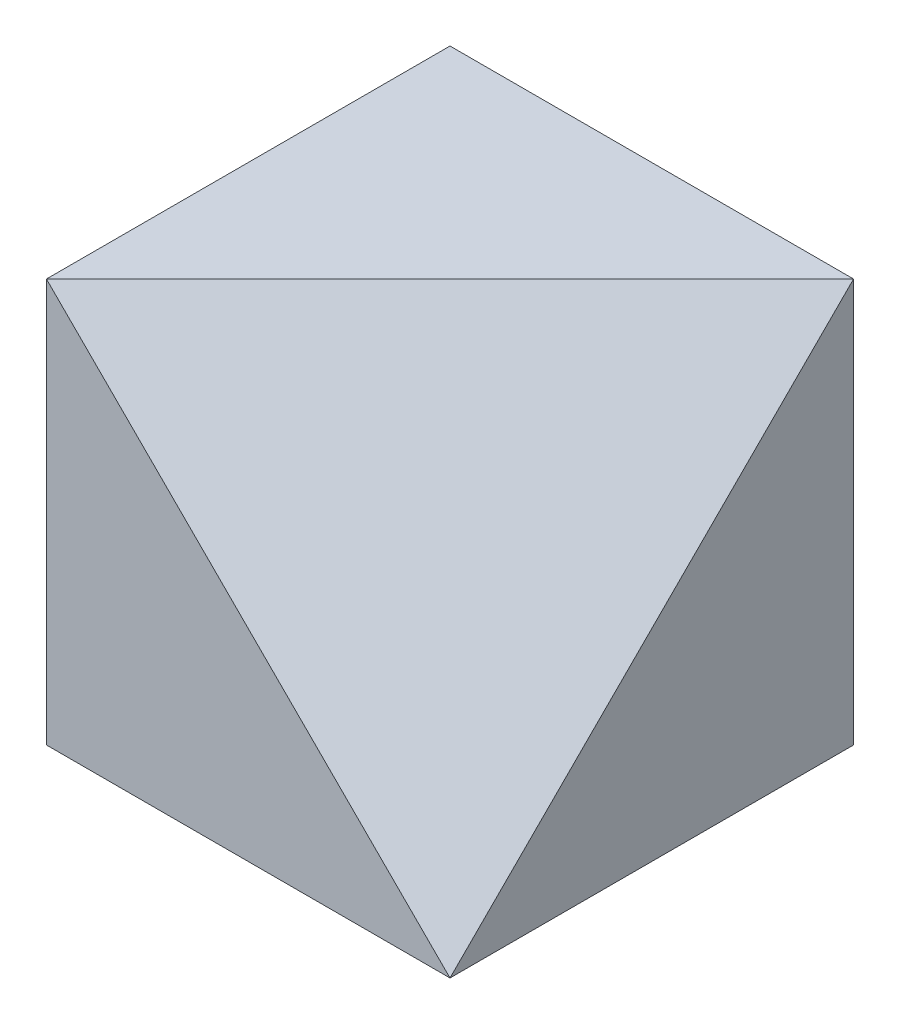
ISO-10303-21;
HEADER;
FILE_DESCRIPTION(('STEP AP214'),'2;1');
FILE_NAME('part.step','',(''),(''),'','','');
FILE_SCHEMA(('AUTOMOTIVE_DESIGN { 1 0 10303 214 1 1 1 1 }'));
ENDSEC;
DATA;
#1=APPLICATION_CONTEXT('core data for automotive mechanical design processes');
#2=APPLICATION_PROTOCOL_DEFINITION('international standard','automotive_design',2000,#1);
#3=PRODUCT_CONTEXT('',#1,'mechanical');
#4=PRODUCT('Part','Part','',(#3));
#5=PRODUCT_RELATED_PRODUCT_CATEGORY('part','',(#4));
#6=PRODUCT_DEFINITION_FORMATION('','',#4);
#7=PRODUCT_DEFINITION_CONTEXT('part definition',#1,'design');
#8=PRODUCT_DEFINITION('design','',#6,#7);
#9=PRODUCT_DEFINITION_SHAPE('','',#8);
#10=(LENGTH_UNIT() NAMED_UNIT(*) SI_UNIT(.MILLI.,.METRE.));
#11=(NAMED_UNIT(*) PLANE_ANGLE_UNIT() SI_UNIT($,.RADIAN.));
#12=(NAMED_UNIT(*) SI_UNIT($,.STERADIAN.) SOLID_ANGLE_UNIT());
#13=UNCERTAINTY_MEASURE_WITH_UNIT(LENGTH_MEASURE(1.E-05),#10,'distance_accuracy_value','');
#14=(GEOMETRIC_REPRESENTATION_CONTEXT(3) GLOBAL_UNCERTAINTY_ASSIGNED_CONTEXT((#13)) GLOBAL_UNIT_ASSIGNED_CONTEXT((#10,
#11,#12)) REPRESENTATION_CONTEXT('',''));
#15=CARTESIAN_POINT('',(0.,0.,0.));
#16=DIRECTION('',(0.,0.,1.));
#17=DIRECTION('',(1.,0.,0.));
#18=AXIS2_PLACEMENT_3D('',#15,#16,#17);
#19=CARTESIAN_POINT('',(63.5,-63.5,63.5));
#20=DIRECTION('',(-1.,0.,0.));
#21=DIRECTION('',(0.,0.,1.));
#22=AXIS2_PLACEMENT_3D('',#19,#20,#21);
#23=PLANE('',#22);
#24=DIRECTION('',(0.,0.707106781186547,-0.707106781186547));
#25=VECTOR('',#24,1.);
#26=CARTESIAN_POINT('',(63.5,-63.5,63.5));
#27=LINE('',#26,#25);
#28=CARTESIAN_POINT('',(63.5,-63.5,63.5));
#29=VERTEX_POINT('',#28);
#30=CARTESIAN_POINT('',(63.5,63.5,-63.5));
#31=VERTEX_POINT('',#30);
#32=EDGE_CURVE('E93',#29,#31,#27,.T.);
#33=ORIENTED_EDGE('',*,*,#32,.F.);
#34=DIRECTION('',(0.,0.,-1.));
#35=VECTOR('',#34,1.);
#36=CARTESIAN_POINT('',(63.5,-63.5,63.5));
#37=LINE('',#36,#35);
#38=CARTESIAN_POINT('',(63.5,-63.5,-63.5));
#39=VERTEX_POINT('',#38);
#40=EDGE_CURVE('E82',#29,#39,#37,.T.);
#41=ORIENTED_EDGE('',*,*,#40,.T.);
#42=DIRECTION('',(0.,1.,0.));
#43=VECTOR('',#42,1.);
#44=CARTESIAN_POINT('',(63.5,-63.5,-63.5));
#45=LINE('',#44,#43);
#46=EDGE_CURVE('E91',#39,#31,#45,.T.);
#47=ORIENTED_EDGE('',*,*,#46,.T.);
#48=EDGE_LOOP('',(#33,#41,#47));
#49=FACE_BOUND('',#48,.T.);
#50=ADVANCED_FACE('F39',(#49),#23,.F.);
#51=CARTESIAN_POINT('',(-63.5,63.5,63.5));
#52=DIRECTION('',(0.,-1.,0.));
#53=DIRECTION('',(0.,0.,-1.));
#54=AXIS2_PLACEMENT_3D('',#51,#52,#53);
#55=PLANE('',#54);
#56=DIRECTION('',(-0.707106781186547,0.,0.707106781186547));
#57=VECTOR('',#56,1.);
#58=CARTESIAN_POINT('',(-63.5,63.5,63.5));
#59=LINE('',#58,#57);
#60=CARTESIAN_POINT('',(-63.5,63.5,63.5));
#61=VERTEX_POINT('',#60);
#62=EDGE_CURVE('E48',#31,#61,#59,.T.);
#63=ORIENTED_EDGE('',*,*,#62,.F.);
#64=DIRECTION('',(-1.,0.,0.));
#65=VECTOR('',#64,1.);
#66=CARTESIAN_POINT('',(-63.5,63.5,-63.5));
#67=LINE('',#66,#65);
#68=CARTESIAN_POINT('',(-63.5,63.5,-63.5));
#69=VERTEX_POINT('',#68);
#70=EDGE_CURVE('E99',#31,#69,#67,.T.);
#71=ORIENTED_EDGE('',*,*,#70,.T.);
#72=DIRECTION('',(0.,0.,-1.));
#73=VECTOR('',#72,1.);
#74=CARTESIAN_POINT('',(-63.5,63.5,63.5));
#75=LINE('',#74,#73);
#76=EDGE_CURVE('E111',#61,#69,#75,.T.);
#77=ORIENTED_EDGE('',*,*,#76,.F.);
#78=EDGE_LOOP('',(#63,#71,#77));
#79=FACE_BOUND('',#78,.T.);
#80=ADVANCED_FACE('F121',(#79),#55,.F.);
#81=CARTESIAN_POINT('',(-63.5,-63.5,63.5));
#82=DIRECTION('',(1.,0.,0.));
#83=DIRECTION('',(0.,0.,-1.));
#84=AXIS2_PLACEMENT_3D('',#81,#82,#83);
#85=PLANE('',#84);
#86=DIRECTION('',(0.,-1.,0.));
#87=VECTOR('',#86,1.);
#88=CARTESIAN_POINT('',(-63.5,-63.5,-63.5));
#89=LINE('',#88,#87);
#90=CARTESIAN_POINT('',(-63.5,-63.5,-63.5));
#91=VERTEX_POINT('',#90);
#92=EDGE_CURVE('E72',#69,#91,#89,.T.);
#93=ORIENTED_EDGE('',*,*,#92,.T.);
#94=DIRECTION('',(0.,0.,-1.));
#95=VECTOR('',#94,1.);
#96=CARTESIAN_POINT('',(-63.5,-63.5,63.5));
#97=LINE('',#96,#95);
#98=CARTESIAN_POINT('',(-63.5,-63.5,63.5));
#99=VERTEX_POINT('',#98);
#100=EDGE_CURVE('E83',#99,#91,#97,.T.);
#101=ORIENTED_EDGE('',*,*,#100,.F.);
#102=DIRECTION('',(0.,-1.,0.));
#103=VECTOR('',#102,1.);
#104=CARTESIAN_POINT('',(-63.5,-63.5,63.5));
#105=LINE('',#104,#103);
#106=EDGE_CURVE('E56',#61,#99,#105,.T.);
#107=ORIENTED_EDGE('',*,*,#106,.F.);
#108=ORIENTED_EDGE('',*,*,#76,.T.);
#109=EDGE_LOOP('',(#93,#101,#107,#108));
#110=FACE_BOUND('',#109,.T.);
#111=ADVANCED_FACE('F122',(#110),#85,.F.);
#112=CARTESIAN_POINT('',(-63.5,-63.5,63.5));
#113=DIRECTION('',(0.,1.,0.));
#114=DIRECTION('',(0.,0.,1.));
#115=AXIS2_PLACEMENT_3D('',#112,#113,#114);
#116=PLANE('',#115);
#117=DIRECTION('',(1.,0.,0.));
#118=VECTOR('',#117,1.);
#119=CARTESIAN_POINT('',(-63.5,-63.5,-63.5));
#120=LINE('',#119,#118);
#121=EDGE_CURVE('E78',#91,#39,#120,.T.);
#122=ORIENTED_EDGE('',*,*,#121,.T.);
#123=ORIENTED_EDGE('',*,*,#40,.F.);
#124=DIRECTION('',(1.,0.,0.));
#125=VECTOR('',#124,1.);
#126=CARTESIAN_POINT('',(-63.5,-63.5,63.5));
#127=LINE('',#126,#125);
#128=EDGE_CURVE('E95',#99,#29,#127,.T.);
#129=ORIENTED_EDGE('',*,*,#128,.F.);
#130=ORIENTED_EDGE('',*,*,#100,.T.);
#131=EDGE_LOOP('',(#122,#123,#129,#130));
#132=FACE_BOUND('',#131,.T.);
#133=ADVANCED_FACE('F80',(#132),#116,.F.);
#134=CARTESIAN_POINT('',(0.,0.,63.5));
#135=DIRECTION('',(0.,0.,-1.));
#136=DIRECTION('',(-1.,0.,0.));
#137=AXIS2_PLACEMENT_3D('',#134,#135,#136);
#138=PLANE('',#137);
#139=DIRECTION('',(0.707106781186547,-0.707106781186547,0.));
#140=VECTOR('',#139,1.);
#141=CARTESIAN_POINT('',(0.,0.,63.5));
#142=LINE('',#141,#140);
#143=EDGE_CURVE('E11',#61,#29,#142,.T.);
#144=ORIENTED_EDGE('',*,*,#143,.F.);
#145=ORIENTED_EDGE('',*,*,#106,.T.);
#146=ORIENTED_EDGE('',*,*,#128,.T.);
#147=EDGE_LOOP('',(#144,#145,#146));
#148=FACE_BOUND('',#147,.T.);
#149=ADVANCED_FACE('F125',(#148),#138,.F.);
#150=CARTESIAN_POINT('',(0.,0.,-63.5));
#151=DIRECTION('',(0.,0.,-1.));
#152=DIRECTION('',(-1.,0.,0.));
#153=AXIS2_PLACEMENT_3D('',#150,#151,#152);
#154=PLANE('',#153);
#155=ORIENTED_EDGE('',*,*,#46,.F.);
#156=ORIENTED_EDGE('',*,*,#121,.F.);
#157=ORIENTED_EDGE('',*,*,#92,.F.);
#158=ORIENTED_EDGE('',*,*,#70,.F.);
#159=EDGE_LOOP('',(#155,#156,#157,#158));
#160=FACE_BOUND('',#159,.T.);
#161=ADVANCED_FACE('F98',(#160),#154,.T.);
#162=CARTESIAN_POINT('',(21.1666666666667,21.1666666666667,21.1666666666667));
#163=DIRECTION('',(0.577350269189626,0.577350269189626,0.577350269189626));
#164=DIRECTION('',(0.707106781186547,0.,-0.707106781186547));
#165=AXIS2_PLACEMENT_3D('',#162,#163,#164);
#166=PLANE('',#165);
#167=ORIENTED_EDGE('',*,*,#143,.T.);
#168=ORIENTED_EDGE('',*,*,#32,.T.);
#169=ORIENTED_EDGE('',*,*,#62,.T.);
#170=EDGE_LOOP('',(#167,#168,#169));
#171=FACE_BOUND('',#170,.T.);
#172=ADVANCED_FACE('F118',(#171),#166,.T.);
#173=CLOSED_SHELL('',(#50,#80,#111,#133,#149,#161,#172));
#174=MANIFOLD_SOLID_BREP('B2',#173);
#175=ADVANCED_BREP_SHAPE_REPRESENTATION('',(#18,#174),#14);
#176=SHAPE_DEFINITION_REPRESENTATION(#9,#175);
ENDSEC;
END-ISO-10303-21;
